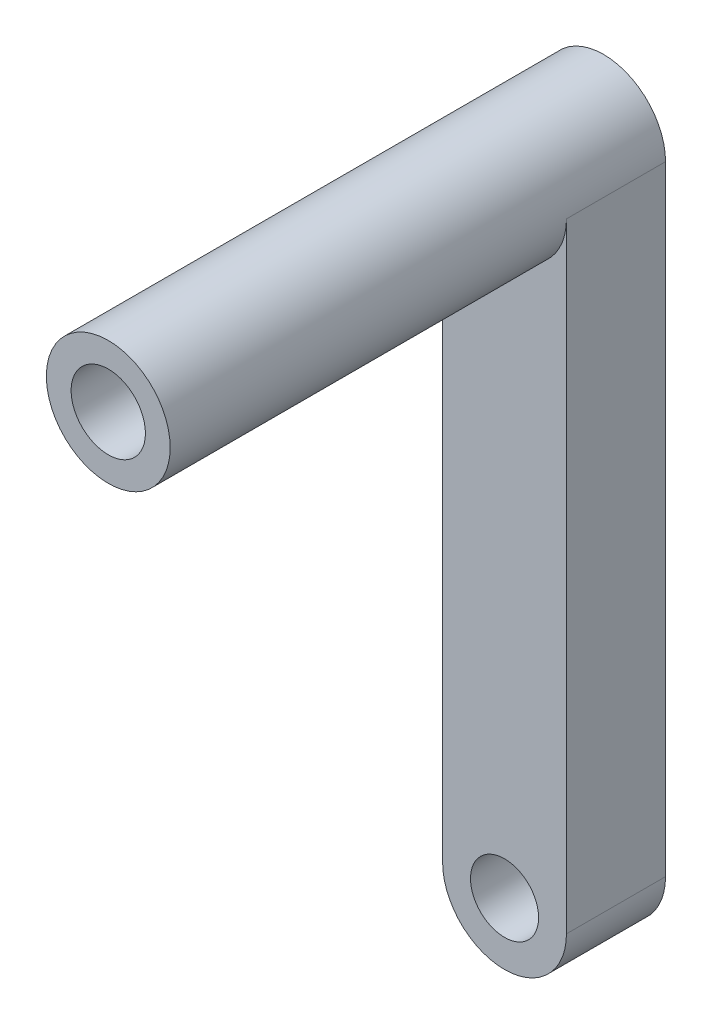
ISO-10303-21;
HEADER;
FILE_DESCRIPTION(('STEP AP214'),'2;1');
FILE_NAME('part.step','',(''),(''),'','','');
FILE_SCHEMA(('AUTOMOTIVE_DESIGN { 1 0 10303 214 1 1 1 1 }'));
ENDSEC;
DATA;
#1=APPLICATION_CONTEXT('core data for automotive mechanical design processes');
#2=APPLICATION_PROTOCOL_DEFINITION('international standard','automotive_design',2000,#1);
#3=PRODUCT_CONTEXT('',#1,'mechanical');
#4=PRODUCT('Part','Part','',(#3));
#5=PRODUCT_RELATED_PRODUCT_CATEGORY('part','',(#4));
#6=PRODUCT_DEFINITION_FORMATION('','',#4);
#7=PRODUCT_DEFINITION_CONTEXT('part definition',#1,'design');
#8=PRODUCT_DEFINITION('design','',#6,#7);
#9=PRODUCT_DEFINITION_SHAPE('','',#8);
#10=(LENGTH_UNIT() NAMED_UNIT(*) SI_UNIT(.MILLI.,.METRE.));
#11=(NAMED_UNIT(*) PLANE_ANGLE_UNIT() SI_UNIT($,.RADIAN.));
#12=(NAMED_UNIT(*) SI_UNIT($,.STERADIAN.) SOLID_ANGLE_UNIT());
#13=UNCERTAINTY_MEASURE_WITH_UNIT(LENGTH_MEASURE(1.E-05),#10,'distance_accuracy_value','');
#14=(GEOMETRIC_REPRESENTATION_CONTEXT(3) GLOBAL_UNCERTAINTY_ASSIGNED_CONTEXT((#13)) GLOBAL_UNIT_ASSIGNED_CONTEXT((#10,
#11,#12)) REPRESENTATION_CONTEXT('',''));
#15=CARTESIAN_POINT('',(0.,0.,0.));
#16=DIRECTION('',(0.,0.,1.));
#17=DIRECTION('',(1.,0.,0.));
#18=AXIS2_PLACEMENT_3D('',#15,#16,#17);
#19=CARTESIAN_POINT('',(2.5,0.,4.));
#20=DIRECTION('',(-1.,0.,0.));
#21=DIRECTION('',(0.,0.,1.));
#22=AXIS2_PLACEMENT_3D('',#19,#20,#21);
#23=PLANE('',#22);
#24=DIRECTION('',(0.,1.,0.));
#25=VECTOR('',#24,1.);
#26=CARTESIAN_POINT('',(2.5,0.,0.));
#27=LINE('',#26,#25);
#28=CARTESIAN_POINT('',(2.5,-10.1470588235294,0.));
#29=VERTEX_POINT('',#28);
#30=CARTESIAN_POINT('',(2.5,14.8529411764706,0.));
#31=VERTEX_POINT('',#30);
#32=EDGE_CURVE('E80',#29,#31,#27,.T.);
#33=ORIENTED_EDGE('',*,*,#32,.T.);
#34=DIRECTION('',(0.,0.,-1.));
#35=VECTOR('',#34,1.);
#36=CARTESIAN_POINT('',(2.5,14.8529411764706,4.));
#37=LINE('',#36,#35);
#38=CARTESIAN_POINT('',(2.5,14.8529411764706,4.));
#39=VERTEX_POINT('',#38);
#40=EDGE_CURVE('E11',#39,#31,#37,.T.);
#41=ORIENTED_EDGE('',*,*,#40,.F.);
#42=DIRECTION('',(0.,1.,0.));
#43=VECTOR('',#42,1.);
#44=CARTESIAN_POINT('',(2.5,0.,4.));
#45=LINE('',#44,#43);
#46=CARTESIAN_POINT('',(2.5,-10.1470588235294,4.));
#47=VERTEX_POINT('',#46);
#48=EDGE_CURVE('E81',#47,#39,#45,.T.);
#49=ORIENTED_EDGE('',*,*,#48,.F.);
#50=DIRECTION('',(0.,0.,-1.));
#51=VECTOR('',#50,1.);
#52=CARTESIAN_POINT('',(2.5,-10.1470588235294,4.));
#53=LINE('',#52,#51);
#54=EDGE_CURVE('E68',#47,#29,#53,.T.);
#55=ORIENTED_EDGE('',*,*,#54,.T.);
#56=EDGE_LOOP('',(#33,#41,#49,#55));
#57=FACE_BOUND('',#56,.T.);
#58=ADVANCED_FACE('F34',(#57),#23,.F.);
#59=CARTESIAN_POINT('',(-2.5,0.,4.));
#60=DIRECTION('',(-1.,0.,0.));
#61=DIRECTION('',(0.,0.,1.));
#62=AXIS2_PLACEMENT_3D('',#59,#60,#61);
#63=PLANE('',#62);
#64=DIRECTION('',(0.,1.,0.));
#65=VECTOR('',#64,1.);
#66=CARTESIAN_POINT('',(-2.5,0.,0.));
#67=LINE('',#66,#65);
#68=CARTESIAN_POINT('',(-2.5,-10.1470588235294,0.));
#69=VERTEX_POINT('',#68);
#70=CARTESIAN_POINT('',(-2.5,14.8529411764706,0.));
#71=VERTEX_POINT('',#70);
#72=EDGE_CURVE('E75',#69,#71,#67,.T.);
#73=ORIENTED_EDGE('',*,*,#72,.F.);
#74=DIRECTION('',(0.,0.,-1.));
#75=VECTOR('',#74,1.);
#76=CARTESIAN_POINT('',(-2.5,-10.1470588235294,4.));
#77=LINE('',#76,#75);
#78=CARTESIAN_POINT('',(-2.5,-10.1470588235294,4.));
#79=VERTEX_POINT('',#78);
#80=EDGE_CURVE('E63',#79,#69,#77,.T.);
#81=ORIENTED_EDGE('',*,*,#80,.F.);
#82=DIRECTION('',(0.,1.,0.));
#83=VECTOR('',#82,1.);
#84=CARTESIAN_POINT('',(-2.5,0.,4.));
#85=LINE('',#84,#83);
#86=CARTESIAN_POINT('',(-2.5,14.8529411764706,4.));
#87=VERTEX_POINT('',#86);
#88=EDGE_CURVE('E105',#79,#87,#85,.T.);
#89=ORIENTED_EDGE('',*,*,#88,.T.);
#90=DIRECTION('',(0.,0.,-1.));
#91=VECTOR('',#90,1.);
#92=CARTESIAN_POINT('',(-2.5,14.8529411764706,4.));
#93=LINE('',#92,#91);
#94=EDGE_CURVE('E42',#87,#71,#93,.T.);
#95=ORIENTED_EDGE('',*,*,#94,.T.);
#96=EDGE_LOOP('',(#73,#81,#89,#95));
#97=FACE_BOUND('',#96,.T.);
#98=ADVANCED_FACE('F104',(#97),#63,.T.);
#99=CARTESIAN_POINT('',(0.,-10.1470588235294,4.));
#100=DIRECTION('',(0.,0.,-1.));
#101=DIRECTION('',(-1.,0.,0.));
#102=AXIS2_PLACEMENT_3D('',#99,#100,#101);
#103=CYLINDRICAL_SURFACE('',#102,2.5);
#104=CARTESIAN_POINT('',(0.,-10.1470588235294,0.));
#105=DIRECTION('',(0.,0.,1.));
#106=DIRECTION('',(1.,0.,0.));
#107=AXIS2_PLACEMENT_3D('',#104,#105,#106);
#108=CIRCLE('',#107,2.5);
#109=EDGE_CURVE('E65',#69,#29,#108,.T.);
#110=ORIENTED_EDGE('',*,*,#109,.T.);
#111=ORIENTED_EDGE('',*,*,#54,.F.);
#112=CARTESIAN_POINT('',(0.,-10.1470588235294,4.));
#113=DIRECTION('',(0.,0.,1.));
#114=DIRECTION('',(1.,0.,0.));
#115=AXIS2_PLACEMENT_3D('',#112,#113,#114);
#116=CIRCLE('',#115,2.5);
#117=EDGE_CURVE('E50',#79,#47,#116,.T.);
#118=ORIENTED_EDGE('',*,*,#117,.F.);
#119=ORIENTED_EDGE('',*,*,#80,.T.);
#120=EDGE_LOOP('',(#110,#111,#118,#119));
#121=FACE_BOUND('',#120,.T.);
#122=ADVANCED_FACE('F67',(#121),#103,.T.);
#123=CARTESIAN_POINT('',(0.,-10.1470588235294,4.));
#124=DIRECTION('',(0.,0.,-1.));
#125=DIRECTION('',(-1.,0.,0.));
#126=AXIS2_PLACEMENT_3D('',#123,#124,#125);
#127=CYLINDRICAL_SURFACE('',#126,1.375);
#128=CARTESIAN_POINT('',(0.,-10.1470588235294,4.));
#129=DIRECTION('',(0.,0.,1.));
#130=DIRECTION('',(1.,0.,0.));
#131=AXIS2_PLACEMENT_3D('',#128,#129,#130);
#132=CIRCLE('',#131,1.375);
#133=CARTESIAN_POINT('',(1.375,-10.1470588235294,4.));
#134=VERTEX_POINT('',#133);
#135=EDGE_CURVE('E82',#134,#134,#132,.T.);
#136=ORIENTED_EDGE('',*,*,#135,.T.);
#137=EDGE_LOOP('',(#136));
#138=FACE_BOUND('',#137,.T.);
#139=CARTESIAN_POINT('',(0.,-10.1470588235294,0.));
#140=DIRECTION('',(0.,0.,1.));
#141=DIRECTION('',(1.,0.,0.));
#142=AXIS2_PLACEMENT_3D('',#139,#140,#141);
#143=CIRCLE('',#142,1.375);
#144=CARTESIAN_POINT('',(1.375,-10.1470588235294,0.));
#145=VERTEX_POINT('',#144);
#146=EDGE_CURVE('E74',#145,#145,#143,.T.);
#147=ORIENTED_EDGE('',*,*,#146,.F.);
#148=EDGE_LOOP('',(#147));
#149=FACE_BOUND('',#148,.T.);
#150=ADVANCED_FACE('F123',(#138,#149),#127,.F.);
#151=CARTESIAN_POINT('',(0.,0.,4.));
#152=DIRECTION('',(0.,0.,1.));
#153=DIRECTION('',(1.,0.,0.));
#154=AXIS2_PLACEMENT_3D('',#151,#152,#153);
#155=PLANE('',#154);
#156=ORIENTED_EDGE('',*,*,#48,.T.);
#157=CARTESIAN_POINT('',(0.,14.8529411764706,4.));
#158=DIRECTION('',(0.,0.,1.));
#159=DIRECTION('',(1.,0.,0.));
#160=AXIS2_PLACEMENT_3D('',#157,#158,#159);
#161=CIRCLE('',#160,2.5);
#162=EDGE_CURVE('E113',#87,#39,#161,.T.);
#163=ORIENTED_EDGE('',*,*,#162,.F.);
#164=ORIENTED_EDGE('',*,*,#88,.F.);
#165=ORIENTED_EDGE('',*,*,#117,.T.);
#166=EDGE_LOOP('',(#156,#163,#164,#165));
#167=FACE_BOUND('',#166,.T.);
#168=ORIENTED_EDGE('',*,*,#135,.F.);
#169=EDGE_LOOP('',(#168));
#170=FACE_BOUND('',#169,.T.);
#171=ADVANCED_FACE('F114',(#167,#170),#155,.T.);
#172=CARTESIAN_POINT('',(0.,0.,0.));
#173=DIRECTION('',(0.,0.,1.));
#174=DIRECTION('',(1.,0.,0.));
#175=AXIS2_PLACEMENT_3D('',#172,#173,#174);
#176=PLANE('',#175);
#177=ORIENTED_EDGE('',*,*,#32,.F.);
#178=ORIENTED_EDGE('',*,*,#109,.F.);
#179=ORIENTED_EDGE('',*,*,#72,.T.);
#180=CARTESIAN_POINT('',(0.,14.8529411764706,0.));
#181=DIRECTION('',(0.,0.,1.));
#182=DIRECTION('',(1.,0.,0.));
#183=AXIS2_PLACEMENT_3D('',#180,#181,#182);
#184=CIRCLE('',#183,2.5);
#185=EDGE_CURVE('E87',#31,#71,#184,.T.);
#186=ORIENTED_EDGE('',*,*,#185,.F.);
#187=EDGE_LOOP('',(#177,#178,#179,#186));
#188=FACE_BOUND('',#187,.T.);
#189=ORIENTED_EDGE('',*,*,#146,.T.);
#190=EDGE_LOOP('',(#189));
#191=FACE_BOUND('',#190,.T.);
#192=CARTESIAN_POINT('',(0.,14.8529411764706,0.));
#193=DIRECTION('',(0.,0.,1.));
#194=DIRECTION('',(1.,0.,0.));
#195=AXIS2_PLACEMENT_3D('',#192,#193,#194);
#196=CIRCLE('',#195,1.5);
#197=CARTESIAN_POINT('',(1.5,14.8529411764706,0.));
#198=VERTEX_POINT('',#197);
#199=EDGE_CURVE('E204',#198,#198,#196,.T.);
#200=ORIENTED_EDGE('',*,*,#199,.T.);
#201=EDGE_LOOP('',(#200));
#202=FACE_BOUND('',#201,.T.);
#203=ADVANCED_FACE('F84',(#188,#191,#202),#176,.F.);
#204=CARTESIAN_POINT('',(0.,14.8529411764706,20.));
#205=DIRECTION('',(0.,0.,-1.));
#206=DIRECTION('',(-1.,0.,0.));
#207=AXIS2_PLACEMENT_3D('',#204,#205,#206);
#208=CYLINDRICAL_SURFACE('',#207,1.5);
#209=CARTESIAN_POINT('',(0.,14.8529411764706,20.));
#210=DIRECTION('',(0.,0.,1.));
#211=DIRECTION('',(1.,0.,0.));
#212=AXIS2_PLACEMENT_3D('',#209,#210,#211);
#213=CIRCLE('',#212,1.5);
#214=CARTESIAN_POINT('',(1.5,14.8529411764706,20.));
#215=VERTEX_POINT('',#214);
#216=EDGE_CURVE('E92',#215,#215,#213,.T.);
#217=ORIENTED_EDGE('',*,*,#216,.T.);
#218=EDGE_LOOP('',(#217));
#219=FACE_BOUND('',#218,.T.);
#220=ORIENTED_EDGE('',*,*,#199,.F.);
#221=EDGE_LOOP('',(#220));
#222=FACE_BOUND('',#221,.T.);
#223=ADVANCED_FACE('F131',(#219,#222),#208,.F.);
#224=CARTESIAN_POINT('',(0.,14.8529411764706,20.));
#225=DIRECTION('',(0.,0.,-1.));
#226=DIRECTION('',(-1.,0.,0.));
#227=AXIS2_PLACEMENT_3D('',#224,#225,#226);
#228=CYLINDRICAL_SURFACE('',#227,2.5);
#229=ORIENTED_EDGE('',*,*,#40,.T.);
#230=ORIENTED_EDGE('',*,*,#185,.T.);
#231=ORIENTED_EDGE('',*,*,#94,.F.);
#232=ORIENTED_EDGE('',*,*,#162,.T.);
#233=EDGE_LOOP('',(#229,#230,#231,#232));
#234=FACE_BOUND('',#233,.T.);
#235=CARTESIAN_POINT('',(0.,14.8529411764706,20.));
#236=DIRECTION('',(0.,0.,1.));
#237=DIRECTION('',(1.,0.,0.));
#238=AXIS2_PLACEMENT_3D('',#235,#236,#237);
#239=CIRCLE('',#238,2.5);
#240=CARTESIAN_POINT('',(2.5,14.8529411764706,20.));
#241=VERTEX_POINT('',#240);
#242=EDGE_CURVE('E88',#241,#241,#239,.T.);
#243=ORIENTED_EDGE('',*,*,#242,.F.);
#244=EDGE_LOOP('',(#243));
#245=FACE_BOUND('',#244,.T.);
#246=ADVANCED_FACE('F111',(#234,#245),#228,.T.);
#247=CARTESIAN_POINT('',(0.,0.,20.));
#248=DIRECTION('',(0.,0.,1.));
#249=DIRECTION('',(1.,0.,0.));
#250=AXIS2_PLACEMENT_3D('',#247,#248,#249);
#251=PLANE('',#250);
#252=ORIENTED_EDGE('',*,*,#216,.F.);
#253=EDGE_LOOP('',(#252));
#254=FACE_BOUND('',#253,.T.);
#255=ORIENTED_EDGE('',*,*,#242,.T.);
#256=EDGE_LOOP('',(#255));
#257=FACE_BOUND('',#256,.T.);
#258=ADVANCED_FACE('F186',(#254,#257),#251,.T.);
#259=CLOSED_SHELL('',(#58,#98,#122,#150,#171,#203,#223,#246,#258));
#260=MANIFOLD_SOLID_BREP('B2',#259);
#261=ADVANCED_BREP_SHAPE_REPRESENTATION('',(#18,#260),#14);
#262=SHAPE_DEFINITION_REPRESENTATION(#9,#261);
ENDSEC;
END-ISO-10303-21;
